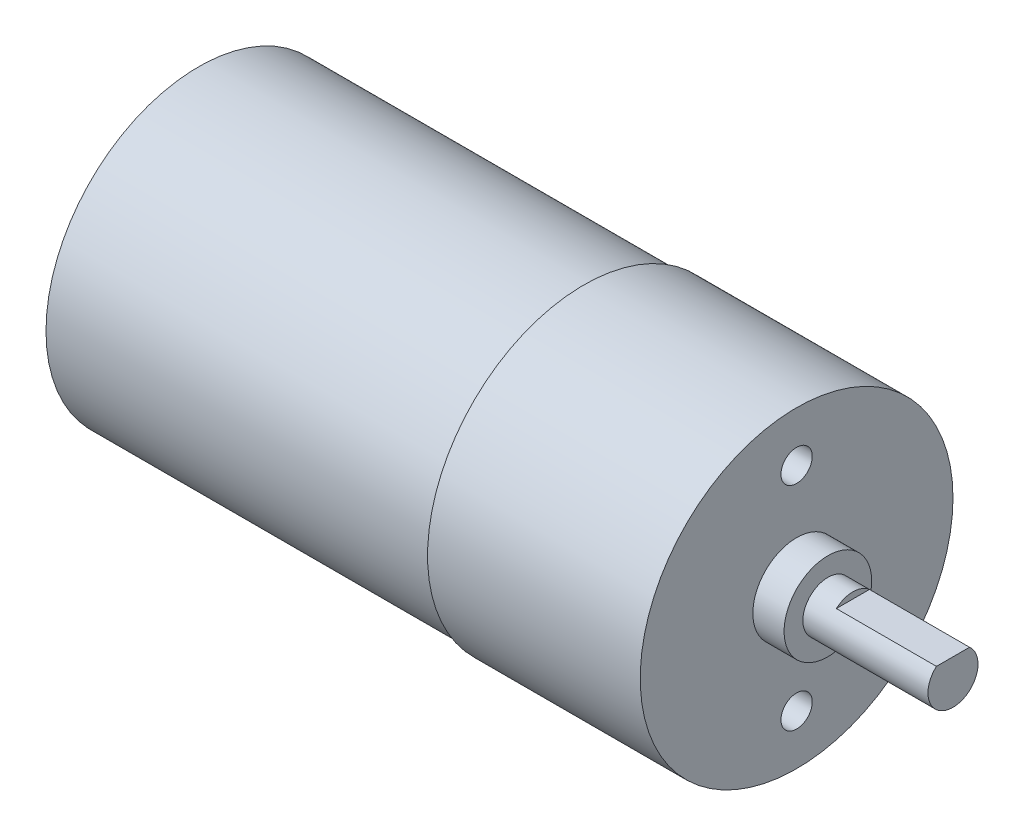
ISO-10303-21;
HEADER;
FILE_DESCRIPTION(('STEP AP214'),'2;1');
FILE_NAME('part.step','',(''),(''),'','','');
FILE_SCHEMA(('AUTOMOTIVE_DESIGN { 1 0 10303 214 1 1 1 1 }'));
ENDSEC;
DATA;
#1=APPLICATION_CONTEXT('core data for automotive mechanical design processes');
#2=APPLICATION_PROTOCOL_DEFINITION('international standard','automotive_design',2000,#1);
#3=PRODUCT_CONTEXT('',#1,'mechanical');
#4=PRODUCT('Part','Part','',(#3));
#5=PRODUCT_RELATED_PRODUCT_CATEGORY('part','',(#4));
#6=PRODUCT_DEFINITION_FORMATION('','',#4);
#7=PRODUCT_DEFINITION_CONTEXT('part definition',#1,'design');
#8=PRODUCT_DEFINITION('design','',#6,#7);
#9=PRODUCT_DEFINITION_SHAPE('','',#8);
#10=(LENGTH_UNIT() NAMED_UNIT(*) SI_UNIT(.MILLI.,.METRE.));
#11=(NAMED_UNIT(*) PLANE_ANGLE_UNIT() SI_UNIT($,.RADIAN.));
#12=(NAMED_UNIT(*) SI_UNIT($,.STERADIAN.) SOLID_ANGLE_UNIT());
#13=UNCERTAINTY_MEASURE_WITH_UNIT(LENGTH_MEASURE(1.E-05),#10,'distance_accuracy_value','');
#14=(GEOMETRIC_REPRESENTATION_CONTEXT(3) GLOBAL_UNCERTAINTY_ASSIGNED_CONTEXT((#13)) GLOBAL_UNIT_ASSIGNED_CONTEXT((#10,
#11,#12)) REPRESENTATION_CONTEXT('',''));
#15=CARTESIAN_POINT('',(0.,0.,0.));
#16=DIRECTION('',(0.,0.,1.));
#17=DIRECTION('',(1.,0.,0.));
#18=AXIS2_PLACEMENT_3D('',#15,#16,#17);
#19=CARTESIAN_POINT('',(12.5,0.,0.));
#20=DIRECTION('',(-1.,0.,0.));
#21=DIRECTION('',(0.,0.,1.));
#22=AXIS2_PLACEMENT_3D('',#19,#20,#21);
#23=CYLINDRICAL_SURFACE('',#22,2.);
#24=CARTESIAN_POINT('',(2.5,0.,0.));
#25=DIRECTION('',(1.,0.,0.));
#26=DIRECTION('',(0.,0.,-1.));
#27=AXIS2_PLACEMENT_3D('',#24,#25,#26);
#28=CIRCLE('',#27,2.);
#29=CARTESIAN_POINT('',(2.5,0.,-2.));
#30=VERTEX_POINT('',#29);
#31=EDGE_CURVE('E109',#30,#30,#28,.T.);
#32=ORIENTED_EDGE('',*,*,#31,.T.);
#33=EDGE_LOOP('',(#32));
#34=FACE_BOUND('',#33,.T.);
#35=DIRECTION('',(-1.,0.,0.));
#36=VECTOR('',#35,1.);
#37=CARTESIAN_POINT('',(136.750715304654,1.5,-1.3228756555323));
#38=LINE('',#37,#36);
#39=CARTESIAN_POINT('',(12.5,1.5,-1.3228756555323));
#40=VERTEX_POINT('',#39);
#41=CARTESIAN_POINT('',(4.5,1.5,-1.3228756555323));
#42=VERTEX_POINT('',#41);
#43=EDGE_CURVE('E105',#40,#42,#38,.T.);
#44=ORIENTED_EDGE('',*,*,#43,.F.);
#45=CARTESIAN_POINT('',(12.5,0.,0.));
#46=DIRECTION('',(1.,0.,0.));
#47=DIRECTION('',(0.,0.,-1.));
#48=AXIS2_PLACEMENT_3D('',#45,#46,#47);
#49=CIRCLE('',#48,2.);
#50=CARTESIAN_POINT('',(12.5,1.5,1.3228756555323));
#51=VERTEX_POINT('',#50);
#52=EDGE_CURVE('E111',#51,#40,#49,.T.);
#53=ORIENTED_EDGE('',*,*,#52,.F.);
#54=DIRECTION('',(-1.,0.,0.));
#55=VECTOR('',#54,1.);
#56=CARTESIAN_POINT('',(136.750715304654,1.5,1.3228756555323));
#57=LINE('',#56,#55);
#58=CARTESIAN_POINT('',(4.5,1.5,1.3228756555323));
#59=VERTEX_POINT('',#58);
#60=EDGE_CURVE('E63',#51,#59,#57,.T.);
#61=ORIENTED_EDGE('',*,*,#60,.T.);
#62=CARTESIAN_POINT('',(4.5,0.,0.));
#63=DIRECTION('',(1.,0.,0.));
#64=DIRECTION('',(0.,0.,-1.));
#65=AXIS2_PLACEMENT_3D('',#62,#63,#64);
#66=CIRCLE('',#65,2.);
#67=EDGE_CURVE('E102',#42,#59,#66,.T.);
#68=ORIENTED_EDGE('',*,*,#67,.F.);
#69=EDGE_LOOP('',(#44,#53,#61,#68));
#70=FACE_BOUND('',#69,.T.);
#71=ADVANCED_FACE('F48',(#34,#70),#23,.T.);
#72=CARTESIAN_POINT('',(12.5,0.,0.));
#73=DIRECTION('',(1.,0.,0.));
#74=DIRECTION('',(0.,0.,-1.));
#75=AXIS2_PLACEMENT_3D('',#72,#73,#74);
#76=PLANE('',#75);
#77=ORIENTED_EDGE('',*,*,#52,.T.);
#78=DIRECTION('',(0.,0.,-1.));
#79=VECTOR('',#78,1.);
#80=CARTESIAN_POINT('',(12.5,1.5,1.3228756555323));
#81=LINE('',#80,#79);
#82=EDGE_CURVE('E67',#51,#40,#81,.T.);
#83=ORIENTED_EDGE('',*,*,#82,.F.);
#84=EDGE_LOOP('',(#77,#83));
#85=FACE_BOUND('',#84,.T.);
#86=ADVANCED_FACE('F134',(#85),#76,.T.);
#87=CARTESIAN_POINT('',(-17.,0.,0.));
#88=DIRECTION('',(1.,0.,0.));
#89=DIRECTION('',(0.,0.,-1.));
#90=AXIS2_PLACEMENT_3D('',#87,#88,#89);
#91=CYLINDRICAL_SURFACE('',#90,12.5);
#92=CARTESIAN_POINT('',(-17.,0.,0.));
#93=DIRECTION('',(1.,0.,0.));
#94=DIRECTION('',(0.,0.,-1.));
#95=AXIS2_PLACEMENT_3D('',#92,#93,#94);
#96=CIRCLE('',#95,12.5);
#97=CARTESIAN_POINT('',(-17.,0.,-12.5));
#98=VERTEX_POINT('',#97);
#99=EDGE_CURVE('E56',#98,#98,#96,.T.);
#100=ORIENTED_EDGE('',*,*,#99,.T.);
#101=EDGE_LOOP('',(#100));
#102=FACE_BOUND('',#101,.T.);
#103=CARTESIAN_POINT('',(0.,0.,0.));
#104=DIRECTION('',(1.,0.,0.));
#105=DIRECTION('',(0.,0.,-1.));
#106=AXIS2_PLACEMENT_3D('',#103,#104,#105);
#107=CIRCLE('',#106,12.5);
#108=CARTESIAN_POINT('',(0.,0.,-12.5));
#109=VERTEX_POINT('',#108);
#110=EDGE_CURVE('E125',#109,#109,#107,.T.);
#111=ORIENTED_EDGE('',*,*,#110,.F.);
#112=EDGE_LOOP('',(#111));
#113=FACE_BOUND('',#112,.T.);
#114=ADVANCED_FACE('F50',(#102,#113),#91,.T.);
#115=CARTESIAN_POINT('',(-17.,0.,0.));
#116=DIRECTION('',(1.,0.,0.));
#117=DIRECTION('',(0.,0.,-1.));
#118=AXIS2_PLACEMENT_3D('',#115,#116,#117);
#119=PLANE('',#118);
#120=CARTESIAN_POINT('',(-17.,0.,0.));
#121=DIRECTION('',(1.,0.,0.));
#122=DIRECTION('',(0.,0.,-1.));
#123=AXIS2_PLACEMENT_3D('',#120,#121,#122);
#124=CIRCLE('',#123,12.2);
#125=CARTESIAN_POINT('',(-17.,0.,-12.2));
#126=VERTEX_POINT('',#125);
#127=EDGE_CURVE('E13',#126,#126,#124,.F.);
#128=ORIENTED_EDGE('',*,*,#127,.F.);
#129=EDGE_LOOP('',(#128));
#130=FACE_BOUND('',#129,.T.);
#131=ORIENTED_EDGE('',*,*,#99,.F.);
#132=EDGE_LOOP('',(#131));
#133=FACE_BOUND('',#132,.T.);
#134=ADVANCED_FACE('F133',(#130,#133),#119,.F.);
#135=CARTESIAN_POINT('',(0.,0.,0.));
#136=DIRECTION('',(1.,0.,0.));
#137=DIRECTION('',(0.,0.,-1.));
#138=AXIS2_PLACEMENT_3D('',#135,#136,#137);
#139=PLANE('',#138);
#140=CARTESIAN_POINT('',(0.,8.5,0.));
#141=DIRECTION('',(1.,0.,0.));
#142=DIRECTION('',(0.,0.,-1.));
#143=AXIS2_PLACEMENT_3D('',#140,#141,#142);
#144=CIRCLE('',#143,1.24999999999999);
#145=CARTESIAN_POINT('',(0.,8.5,-1.24999999999999));
#146=VERTEX_POINT('',#145);
#147=EDGE_CURVE('E92',#146,#146,#144,.T.);
#148=ORIENTED_EDGE('',*,*,#147,.F.);
#149=EDGE_LOOP('',(#148));
#150=FACE_BOUND('',#149,.T.);
#151=CARTESIAN_POINT('',(0.,-8.5,0.));
#152=DIRECTION('',(1.,0.,0.));
#153=DIRECTION('',(0.,0.,-1.));
#154=AXIS2_PLACEMENT_3D('',#151,#152,#153);
#155=CIRCLE('',#154,1.24999999999999);
#156=CARTESIAN_POINT('',(0.,-8.5,-1.24999999999999));
#157=VERTEX_POINT('',#156);
#158=EDGE_CURVE('E91',#157,#157,#155,.T.);
#159=ORIENTED_EDGE('',*,*,#158,.F.);
#160=EDGE_LOOP('',(#159));
#161=FACE_BOUND('',#160,.T.);
#162=CARTESIAN_POINT('',(0.,0.,0.));
#163=DIRECTION('',(1.,0.,0.));
#164=DIRECTION('',(0.,0.,-1.));
#165=AXIS2_PLACEMENT_3D('',#162,#163,#164);
#166=CIRCLE('',#165,3.5);
#167=CARTESIAN_POINT('',(0.,0.,-3.5));
#168=VERTEX_POINT('',#167);
#169=EDGE_CURVE('E114',#168,#168,#166,.T.);
#170=ORIENTED_EDGE('',*,*,#169,.F.);
#171=EDGE_LOOP('',(#170));
#172=FACE_BOUND('',#171,.T.);
#173=ORIENTED_EDGE('',*,*,#110,.T.);
#174=EDGE_LOOP('',(#173));
#175=FACE_BOUND('',#174,.T.);
#176=ADVANCED_FACE('F130',(#150,#161,#172,#175),#139,.T.);
#177=CARTESIAN_POINT('',(-47.8,0.,0.));
#178=DIRECTION('',(1.,0.,0.));
#179=DIRECTION('',(0.,0.,-1.));
#180=AXIS2_PLACEMENT_3D('',#177,#178,#179);
#181=CYLINDRICAL_SURFACE('',#180,12.2);
#182=CARTESIAN_POINT('',(-47.8,0.,0.));
#183=DIRECTION('',(-1.,0.,0.));
#184=DIRECTION('',(0.,0.,1.));
#185=AXIS2_PLACEMENT_3D('',#182,#183,#184);
#186=CIRCLE('',#185,12.2);
#187=CARTESIAN_POINT('',(-47.8,0.,-12.2));
#188=VERTEX_POINT('',#187);
#189=EDGE_CURVE('E120',#188,#188,#186,.T.);
#190=CARTESIAN_POINT('',(-47.8,0.,-12.2));
#191=CARTESIAN_POINT('',(-47.4791666666667,0.,-12.2));
#192=CARTESIAN_POINT('',(-47.1583333333333,0.,-12.2));
#193=CARTESIAN_POINT('',(-46.5166666666667,0.,-12.2));
#194=CARTESIAN_POINT('',(-46.1958333333333,0.,-12.2));
#195=CARTESIAN_POINT('',(-45.5541666666667,0.,-12.2));
#196=CARTESIAN_POINT('',(-45.2333333333333,0.,-12.2));
#197=CARTESIAN_POINT('',(-44.5916666666667,0.,-12.2));
#198=CARTESIAN_POINT('',(-44.2708333333333,0.,-12.2));
#199=CARTESIAN_POINT('',(-43.6291666666667,0.,-12.2));
#200=CARTESIAN_POINT('',(-43.3083333333333,0.,-12.2));
#201=CARTESIAN_POINT('',(-42.6666666666667,0.,-12.2));
#202=CARTESIAN_POINT('',(-42.3458333333333,0.,-12.2));
#203=CARTESIAN_POINT('',(-41.7041666666667,0.,-12.2));
#204=CARTESIAN_POINT('',(-41.3833333333333,0.,-12.2));
#205=CARTESIAN_POINT('',(-40.7416666666667,0.,-12.2));
#206=CARTESIAN_POINT('',(-40.4208333333333,0.,-12.2));
#207=CARTESIAN_POINT('',(-39.7791666666667,0.,-12.2));
#208=CARTESIAN_POINT('',(-39.4583333333333,0.,-12.2));
#209=CARTESIAN_POINT('',(-38.8166666666667,0.,-12.2));
#210=CARTESIAN_POINT('',(-38.4958333333333,0.,-12.2));
#211=CARTESIAN_POINT('',(-37.8541666666667,0.,-12.2));
#212=CARTESIAN_POINT('',(-37.5333333333333,0.,-12.2));
#213=CARTESIAN_POINT('',(-36.8916666666667,0.,-12.2));
#214=CARTESIAN_POINT('',(-36.5708333333333,0.,-12.2));
#215=CARTESIAN_POINT('',(-35.9291666666667,0.,-12.2));
#216=CARTESIAN_POINT('',(-35.6083333333333,0.,-12.2));
#217=CARTESIAN_POINT('',(-34.9666666666667,0.,-12.2));
#218=CARTESIAN_POINT('',(-34.6458333333333,0.,-12.2));
#219=CARTESIAN_POINT('',(-34.0041666666667,0.,-12.2));
#220=CARTESIAN_POINT('',(-33.6833333333333,0.,-12.2));
#221=CARTESIAN_POINT('',(-33.0416666666667,0.,-12.2));
#222=CARTESIAN_POINT('',(-32.7208333333333,0.,-12.2));
#223=CARTESIAN_POINT('',(-32.0791666666667,0.,-12.2));
#224=CARTESIAN_POINT('',(-31.7583333333333,0.,-12.2));
#225=CARTESIAN_POINT('',(-31.1166666666667,0.,-12.2));
#226=CARTESIAN_POINT('',(-30.7958333333333,0.,-12.2));
#227=CARTESIAN_POINT('',(-30.1541666666667,0.,-12.2));
#228=CARTESIAN_POINT('',(-29.8333333333333,0.,-12.2));
#229=CARTESIAN_POINT('',(-29.1916666666667,0.,-12.2));
#230=CARTESIAN_POINT('',(-28.8708333333333,0.,-12.2));
#231=CARTESIAN_POINT('',(-28.2291666666667,0.,-12.2));
#232=CARTESIAN_POINT('',(-27.9083333333333,0.,-12.2));
#233=CARTESIAN_POINT('',(-27.2666666666667,0.,-12.2));
#234=CARTESIAN_POINT('',(-26.9458333333333,0.,-12.2));
#235=CARTESIAN_POINT('',(-26.3041666666667,0.,-12.2));
#236=CARTESIAN_POINT('',(-25.9833333333333,0.,-12.2));
#237=CARTESIAN_POINT('',(-25.3416666666667,0.,-12.2));
#238=CARTESIAN_POINT('',(-25.0208333333333,0.,-12.2));
#239=CARTESIAN_POINT('',(-24.3791666666667,0.,-12.2));
#240=CARTESIAN_POINT('',(-24.0583333333333,0.,-12.2));
#241=CARTESIAN_POINT('',(-23.4166666666667,0.,-12.2));
#242=CARTESIAN_POINT('',(-23.0958333333333,0.,-12.2));
#243=CARTESIAN_POINT('',(-22.4541666666667,0.,-12.2));
#244=CARTESIAN_POINT('',(-22.1333333333333,0.,-12.2));
#245=CARTESIAN_POINT('',(-21.4916666666667,0.,-12.2));
#246=CARTESIAN_POINT('',(-21.1708333333333,0.,-12.2));
#247=CARTESIAN_POINT('',(-20.5291666666667,0.,-12.2));
#248=CARTESIAN_POINT('',(-20.2083333333333,0.,-12.2));
#249=CARTESIAN_POINT('',(-19.5666666666667,0.,-12.2));
#250=CARTESIAN_POINT('',(-19.2458333333333,0.,-12.2));
#251=CARTESIAN_POINT('',(-18.6041666666667,0.,-12.2));
#252=CARTESIAN_POINT('',(-18.2833333333333,0.,-12.2));
#253=CARTESIAN_POINT('',(-17.6416666666667,0.,-12.2));
#254=CARTESIAN_POINT('',(-17.3208333333333,0.,-12.2));
#255=CARTESIAN_POINT('',(-17.,0.,-12.2));
#256=B_SPLINE_CURVE_WITH_KNOTS('',3,(#190,#191,#192,#193,#194,#195,#196,#197,#198,#199,#200,
#201,#202,#203,#204,#205,#206,#207,#208,#209,#210,#211,#212,#213,#214,#215,#216,#217,#218,#219,
#220,#221,#222,#223,#224,#225,#226,#227,#228,#229,#230,#231,#232,#233,#234,#235,#236,#237,#238,
#239,#240,#241,#242,#243,#244,#245,#246,#247,#248,#249,#250,#251,#252,#253,#254,#255),
.UNSPECIFIED.,.F.,.F.,(4,2,2,2,2,2,2,2,2,2,2,2,2,2,2,2,2,2,2,2,2,2,2,2,2,2,2,2,2,2,2,2,4),(0.,
0.962500000000005,1.925,2.8875,3.85,4.8125,5.775,6.7375,7.70000000000001,8.6625,9.625,10.5875,
11.55,12.5125,13.475,14.4375,15.4,16.3625,17.325,18.2875,19.25,20.2125,21.175,22.1375,23.1,
24.0625,25.025,25.9875,26.95,27.9125,28.875,29.8375,30.8),.UNSPECIFIED.);
#257=EDGE_CURVE('BSEAM164',#188,#126,#256,.T.);
#258=ORIENTED_EDGE('',*,*,#189,.F.);
#259=ORIENTED_EDGE('',*,*,#127,.T.);
#260=ORIENTED_EDGE('',*,*,#257,.T.);
#261=ORIENTED_EDGE('',*,*,#257,.F.);
#262=EDGE_LOOP('',(#258,#260,#259,#261));
#263=FACE_BOUND('',#262,.T.);
#264=ADVANCED_FACE('F164',(#263),#181,.T.);
#265=CARTESIAN_POINT('',(-47.8,0.,0.));
#266=DIRECTION('',(-1.,0.,0.));
#267=DIRECTION('',(0.,0.,1.));
#268=AXIS2_PLACEMENT_3D('',#265,#266,#267);
#269=PLANE('',#268);
#270=ORIENTED_EDGE('',*,*,#189,.T.);
#271=EDGE_LOOP('',(#270));
#272=FACE_BOUND('',#271,.T.);
#273=ADVANCED_FACE('F160',(#272),#269,.T.);
#274=CARTESIAN_POINT('',(2.5,0.,0.));
#275=DIRECTION('',(-1.,0.,0.));
#276=DIRECTION('',(0.,0.,1.));
#277=AXIS2_PLACEMENT_3D('',#274,#275,#276);
#278=CYLINDRICAL_SURFACE('',#277,3.5);
#279=CARTESIAN_POINT('',(2.5,0.,0.));
#280=DIRECTION('',(1.,0.,0.));
#281=DIRECTION('',(0.,0.,-1.));
#282=AXIS2_PLACEMENT_3D('',#279,#280,#281);
#283=CIRCLE('',#282,3.5);
#284=CARTESIAN_POINT('',(2.5,0.,-3.5));
#285=VERTEX_POINT('',#284);
#286=EDGE_CURVE('E117',#285,#285,#283,.T.);
#287=ORIENTED_EDGE('',*,*,#286,.F.);
#288=EDGE_LOOP('',(#287));
#289=FACE_BOUND('',#288,.T.);
#290=ORIENTED_EDGE('',*,*,#169,.T.);
#291=EDGE_LOOP('',(#290));
#292=FACE_BOUND('',#291,.T.);
#293=ADVANCED_FACE('F156',(#289,#292),#278,.T.);
#294=CARTESIAN_POINT('',(2.5,0.,0.));
#295=DIRECTION('',(1.,0.,0.));
#296=DIRECTION('',(0.,0.,-1.));
#297=AXIS2_PLACEMENT_3D('',#294,#295,#296);
#298=PLANE('',#297);
#299=ORIENTED_EDGE('',*,*,#31,.F.);
#300=EDGE_LOOP('',(#299));
#301=FACE_BOUND('',#300,.T.);
#302=ORIENTED_EDGE('',*,*,#286,.T.);
#303=EDGE_LOOP('',(#302));
#304=FACE_BOUND('',#303,.T.);
#305=ADVANCED_FACE('F152',(#301,#304),#298,.T.);
#306=CARTESIAN_POINT('',(136.750715304654,1.5,1.3228756555323));
#307=DIRECTION('',(0.,1.,0.));
#308=DIRECTION('',(0.,0.,1.));
#309=AXIS2_PLACEMENT_3D('',#306,#307,#308);
#310=PLANE('',#309);
#311=ORIENTED_EDGE('',*,*,#60,.F.);
#312=ORIENTED_EDGE('',*,*,#82,.T.);
#313=ORIENTED_EDGE('',*,*,#43,.T.);
#314=DIRECTION('',(0.,0.,-1.));
#315=VECTOR('',#314,1.);
#316=CARTESIAN_POINT('',(4.5,1.5,1.3228756555323));
#317=LINE('',#316,#315);
#318=EDGE_CURVE('E103',#59,#42,#317,.T.);
#319=ORIENTED_EDGE('',*,*,#318,.F.);
#320=EDGE_LOOP('',(#311,#312,#313,#319));
#321=FACE_BOUND('',#320,.T.);
#322=ADVANCED_FACE('F155',(#321),#310,.T.);
#323=CARTESIAN_POINT('',(4.5,0.,0.));
#324=DIRECTION('',(1.,0.,0.));
#325=DIRECTION('',(0.,0.,-1.));
#326=AXIS2_PLACEMENT_3D('',#323,#324,#325);
#327=PLANE('',#326);
#328=ORIENTED_EDGE('',*,*,#318,.T.);
#329=ORIENTED_EDGE('',*,*,#67,.T.);
#330=EDGE_LOOP('',(#328,#329));
#331=FACE_BOUND('',#330,.T.);
#332=ADVANCED_FACE('F186',(#331),#327,.T.);
#333=CARTESIAN_POINT('',(-4.55,-8.5,0.));
#334=DIRECTION('',(1.,0.,0.));
#335=DIRECTION('',(0.,0.,-1.));
#336=AXIS2_PLACEMENT_3D('',#333,#334,#335);
#337=CONICAL_SURFACE('',#336,1.24999999999999,1.02974425867665);
#338=CARTESIAN_POINT('',(-5.30107577378444,-8.5,0.));
#339=VERTEX_POINT('',#338);
#340=VERTEX_LOOP('',#339);
#341=FACE_BOUND('',#340,.T.);
#342=CARTESIAN_POINT('',(-4.55,-8.5,0.));
#343=DIRECTION('',(1.,0.,0.));
#344=DIRECTION('',(0.,0.,-1.));
#345=AXIS2_PLACEMENT_3D('',#342,#343,#344);
#346=CIRCLE('',#345,1.24999999999999);
#347=CARTESIAN_POINT('',(-4.55,-8.5,-1.24999999999999));
#348=VERTEX_POINT('',#347);
#349=EDGE_CURVE('E95',#348,#348,#346,.T.);
#350=ORIENTED_EDGE('',*,*,#349,.T.);
#351=EDGE_LOOP('',(#350));
#352=FACE_BOUND('',#351,.T.);
#353=ADVANCED_FACE('F180',(#341,#352),#337,.F.);
#354=CARTESIAN_POINT('',(0.,-8.5,0.));
#355=DIRECTION('',(1.,0.,0.));
#356=DIRECTION('',(0.,0.,-1.));
#357=AXIS2_PLACEMENT_3D('',#354,#355,#356);
#358=CYLINDRICAL_SURFACE('',#357,1.24999999999999);
#359=ORIENTED_EDGE('',*,*,#349,.F.);
#360=EDGE_LOOP('',(#359));
#361=FACE_BOUND('',#360,.T.);
#362=ORIENTED_EDGE('',*,*,#158,.T.);
#363=EDGE_LOOP('',(#362));
#364=FACE_BOUND('',#363,.T.);
#365=ADVANCED_FACE('F85',(#361,#364),#358,.F.);
#366=CARTESIAN_POINT('',(-4.55,8.5,0.));
#367=DIRECTION('',(1.,0.,0.));
#368=DIRECTION('',(0.,0.,-1.));
#369=AXIS2_PLACEMENT_3D('',#366,#367,#368);
#370=CONICAL_SURFACE('',#369,1.24999999999999,1.02974425867665);
#371=CARTESIAN_POINT('',(-5.30107577378444,8.5,0.));
#372=VERTEX_POINT('',#371);
#373=VERTEX_LOOP('',#372);
#374=FACE_BOUND('',#373,.T.);
#375=CARTESIAN_POINT('',(-4.55,8.5,0.));
#376=DIRECTION('',(1.,0.,0.));
#377=DIRECTION('',(0.,0.,-1.));
#378=AXIS2_PLACEMENT_3D('',#375,#376,#377);
#379=CIRCLE('',#378,1.24999999999999);
#380=CARTESIAN_POINT('',(-4.55,8.5,-1.24999999999999));
#381=VERTEX_POINT('',#380);
#382=EDGE_CURVE('E89',#381,#381,#379,.T.);
#383=ORIENTED_EDGE('',*,*,#382,.T.);
#384=EDGE_LOOP('',(#383));
#385=FACE_BOUND('',#384,.T.);
#386=ADVANCED_FACE('F81',(#374,#385),#370,.F.);
#387=CARTESIAN_POINT('',(0.,8.5,0.));
#388=DIRECTION('',(1.,0.,0.));
#389=DIRECTION('',(0.,0.,-1.));
#390=AXIS2_PLACEMENT_3D('',#387,#388,#389);
#391=CYLINDRICAL_SURFACE('',#390,1.24999999999999);
#392=ORIENTED_EDGE('',*,*,#382,.F.);
#393=EDGE_LOOP('',(#392));
#394=FACE_BOUND('',#393,.T.);
#395=ORIENTED_EDGE('',*,*,#147,.T.);
#396=EDGE_LOOP('',(#395));
#397=FACE_BOUND('',#396,.T.);
#398=ADVANCED_FACE('F84',(#394,#397),#391,.F.);
#399=CLOSED_SHELL('',(#71,#86,#114,#134,#176,#264,#273,#293,#305,#322,#332,#353,#365,#386,#398));
#400=MANIFOLD_SOLID_BREP('B2',#399);
#401=ADVANCED_BREP_SHAPE_REPRESENTATION('',(#18,#400),#14);
#402=SHAPE_DEFINITION_REPRESENTATION(#9,#401);
ENDSEC;
END-ISO-10303-21;
